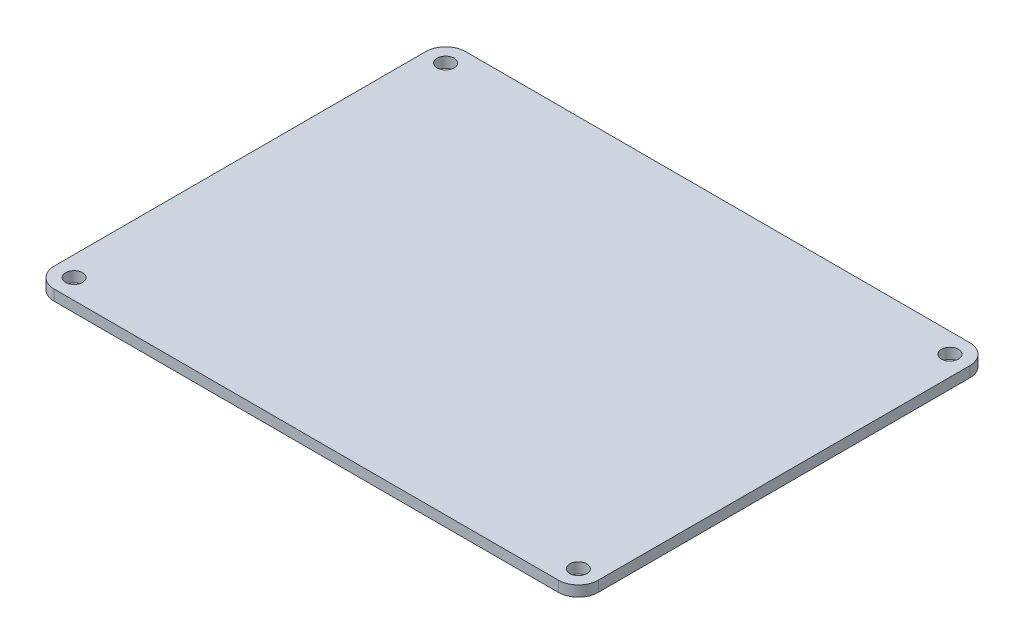
ISO-10303-21;
HEADER;
FILE_DESCRIPTION(('STEP AP214'),'2;1');
FILE_NAME('part.step','',(''),(''),'','','');
FILE_SCHEMA(('AUTOMOTIVE_DESIGN { 1 0 10303 214 1 1 1 1 }'));
ENDSEC;
DATA;
#1=APPLICATION_CONTEXT('core data for automotive mechanical design processes');
#2=APPLICATION_PROTOCOL_DEFINITION('international standard','automotive_design',2000,#1);
#3=PRODUCT_CONTEXT('',#1,'mechanical');
#4=PRODUCT('Part','Part','',(#3));
#5=PRODUCT_RELATED_PRODUCT_CATEGORY('part','',(#4));
#6=PRODUCT_DEFINITION_FORMATION('','',#4);
#7=PRODUCT_DEFINITION_CONTEXT('part definition',#1,'design');
#8=PRODUCT_DEFINITION('design','',#6,#7);
#9=PRODUCT_DEFINITION_SHAPE('','',#8);
#10=(LENGTH_UNIT() NAMED_UNIT(*) SI_UNIT(.MILLI.,.METRE.));
#11=(NAMED_UNIT(*) PLANE_ANGLE_UNIT() SI_UNIT($,.RADIAN.));
#12=(NAMED_UNIT(*) SI_UNIT($,.STERADIAN.) SOLID_ANGLE_UNIT());
#13=UNCERTAINTY_MEASURE_WITH_UNIT(LENGTH_MEASURE(1.E-05),#10,'distance_accuracy_value','');
#14=(GEOMETRIC_REPRESENTATION_CONTEXT(3) GLOBAL_UNCERTAINTY_ASSIGNED_CONTEXT((#13)) GLOBAL_UNIT_ASSIGNED_CONTEXT((#10,
#11,#12)) REPRESENTATION_CONTEXT('',''));
#15=CARTESIAN_POINT('',(0.,0.,0.));
#16=DIRECTION('',(0.,0.,1.));
#17=DIRECTION('',(1.,0.,0.));
#18=AXIS2_PLACEMENT_3D('',#15,#16,#17);
#19=CARTESIAN_POINT('',(-51.25,-2.,0.));
#20=DIRECTION('',(-1.,0.,0.));
#21=DIRECTION('',(0.,0.,1.));
#22=AXIS2_PLACEMENT_3D('',#19,#20,#21);
#23=PLANE('',#22);
#24=DIRECTION('',(0.,0.,1.));
#25=VECTOR('',#24,1.);
#26=CARTESIAN_POINT('',(-51.25,0.,0.));
#27=LINE('',#26,#25);
#28=CARTESIAN_POINT('',(-51.25,0.,-35.));
#29=VERTEX_POINT('',#28);
#30=CARTESIAN_POINT('',(-51.25,0.,35.));
#31=VERTEX_POINT('',#30);
#32=EDGE_CURVE('E148',#29,#31,#27,.T.);
#33=ORIENTED_EDGE('',*,*,#32,.F.);
#34=DIRECTION('',(0.,1.,0.));
#35=VECTOR('',#34,1.);
#36=CARTESIAN_POINT('',(-51.25,-2.,-35.));
#37=LINE('',#36,#35);
#38=CARTESIAN_POINT('',(-51.25,-2.,-35.));
#39=VERTEX_POINT('',#38);
#40=EDGE_CURVE('E11',#39,#29,#37,.T.);
#41=ORIENTED_EDGE('',*,*,#40,.F.);
#42=DIRECTION('',(0.,0.,1.));
#43=VECTOR('',#42,1.);
#44=CARTESIAN_POINT('',(-51.25,-2.,0.));
#45=LINE('',#44,#43);
#46=CARTESIAN_POINT('',(-51.25,-2.,35.));
#47=VERTEX_POINT('',#46);
#48=EDGE_CURVE('E180',#39,#47,#45,.T.);
#49=ORIENTED_EDGE('',*,*,#48,.T.);
#50=DIRECTION('',(0.,1.,0.));
#51=VECTOR('',#50,1.);
#52=CARTESIAN_POINT('',(-51.25,-2.,35.));
#53=LINE('',#52,#51);
#54=EDGE_CURVE('E42',#47,#31,#53,.T.);
#55=ORIENTED_EDGE('',*,*,#54,.T.);
#56=EDGE_LOOP('',(#33,#41,#49,#55));
#57=FACE_BOUND('',#56,.T.);
#58=ADVANCED_FACE('F39',(#57),#23,.T.);
#59=CARTESIAN_POINT('',(-47.5,-2.,-35.));
#60=DIRECTION('',(0.,1.,0.));
#61=DIRECTION('',(0.,0.,1.));
#62=AXIS2_PLACEMENT_3D('',#59,#60,#61);
#63=CYLINDRICAL_SURFACE('',#62,3.75000000000001);
#64=CARTESIAN_POINT('',(-47.5,0.,-35.));
#65=DIRECTION('',(0.,1.,0.));
#66=DIRECTION('',(0.,0.,1.));
#67=AXIS2_PLACEMENT_3D('',#64,#65,#66);
#68=CIRCLE('',#67,3.75000000000001);
#69=CARTESIAN_POINT('',(-47.5,0.,-38.75));
#70=VERTEX_POINT('',#69);
#71=EDGE_CURVE('E166',#70,#29,#68,.T.);
#72=ORIENTED_EDGE('',*,*,#71,.F.);
#73=DIRECTION('',(0.,1.,0.));
#74=VECTOR('',#73,1.);
#75=CARTESIAN_POINT('',(-47.5,-2.,-38.75));
#76=LINE('',#75,#74);
#77=CARTESIAN_POINT('',(-47.5,-2.,-38.75));
#78=VERTEX_POINT('',#77);
#79=EDGE_CURVE('E48',#78,#70,#76,.T.);
#80=ORIENTED_EDGE('',*,*,#79,.F.);
#81=CARTESIAN_POINT('',(-47.5,-2.,-35.));
#82=DIRECTION('',(0.,1.,0.));
#83=DIRECTION('',(0.,0.,1.));
#84=AXIS2_PLACEMENT_3D('',#81,#82,#83);
#85=CIRCLE('',#84,3.75000000000001);
#86=EDGE_CURVE('E117',#78,#39,#85,.T.);
#87=ORIENTED_EDGE('',*,*,#86,.T.);
#88=ORIENTED_EDGE('',*,*,#40,.T.);
#89=EDGE_LOOP('',(#72,#80,#87,#88));
#90=FACE_BOUND('',#89,.T.);
#91=ADVANCED_FACE('F193',(#90),#63,.T.);
#92=CARTESIAN_POINT('',(0.,-2.,-38.75));
#93=DIRECTION('',(0.,0.,1.));
#94=DIRECTION('',(1.,0.,0.));
#95=AXIS2_PLACEMENT_3D('',#92,#93,#94);
#96=PLANE('',#95);
#97=DIRECTION('',(1.,0.,0.));
#98=VECTOR('',#97,1.);
#99=CARTESIAN_POINT('',(0.,0.,-38.75));
#100=LINE('',#99,#98);
#101=CARTESIAN_POINT('',(47.5,0.,-38.75));
#102=VERTEX_POINT('',#101);
#103=EDGE_CURVE('E121',#70,#102,#100,.T.);
#104=ORIENTED_EDGE('',*,*,#103,.T.);
#105=DIRECTION('',(0.,1.,0.));
#106=VECTOR('',#105,1.);
#107=CARTESIAN_POINT('',(47.5,-2.,-38.75));
#108=LINE('',#107,#106);
#109=CARTESIAN_POINT('',(47.5,-2.,-38.75));
#110=VERTEX_POINT('',#109);
#111=EDGE_CURVE('E119',#110,#102,#108,.T.);
#112=ORIENTED_EDGE('',*,*,#111,.F.);
#113=DIRECTION('',(1.,0.,0.));
#114=VECTOR('',#113,1.);
#115=CARTESIAN_POINT('',(0.,-2.,-38.75));
#116=LINE('',#115,#114);
#117=EDGE_CURVE('E111',#78,#110,#116,.T.);
#118=ORIENTED_EDGE('',*,*,#117,.F.);
#119=ORIENTED_EDGE('',*,*,#79,.T.);
#120=EDGE_LOOP('',(#104,#112,#118,#119));
#121=FACE_BOUND('',#120,.T.);
#122=ADVANCED_FACE('F120',(#121),#96,.F.);
#123=CARTESIAN_POINT('',(47.5,-2.,-35.));
#124=DIRECTION('',(0.,1.,0.));
#125=DIRECTION('',(0.,0.,1.));
#126=AXIS2_PLACEMENT_3D('',#123,#124,#125);
#127=CYLINDRICAL_SURFACE('',#126,3.75);
#128=CARTESIAN_POINT('',(47.5,0.,-35.));
#129=DIRECTION('',(0.,1.,0.));
#130=DIRECTION('',(0.,0.,1.));
#131=AXIS2_PLACEMENT_3D('',#128,#129,#130);
#132=CIRCLE('',#131,3.75);
#133=CARTESIAN_POINT('',(51.25,0.,-35.));
#134=VERTEX_POINT('',#133);
#135=EDGE_CURVE('E163',#134,#102,#132,.T.);
#136=ORIENTED_EDGE('',*,*,#135,.F.);
#137=DIRECTION('',(0.,1.,0.));
#138=VECTOR('',#137,1.);
#139=CARTESIAN_POINT('',(51.25,-2.,-35.));
#140=LINE('',#139,#138);
#141=CARTESIAN_POINT('',(51.25,-2.,-35.));
#142=VERTEX_POINT('',#141);
#143=EDGE_CURVE('E125',#142,#134,#140,.T.);
#144=ORIENTED_EDGE('',*,*,#143,.F.);
#145=CARTESIAN_POINT('',(47.5,-2.,-35.));
#146=DIRECTION('',(0.,1.,0.));
#147=DIRECTION('',(0.,0.,1.));
#148=AXIS2_PLACEMENT_3D('',#145,#146,#147);
#149=CIRCLE('',#148,3.75);
#150=EDGE_CURVE('E116',#142,#110,#149,.T.);
#151=ORIENTED_EDGE('',*,*,#150,.T.);
#152=ORIENTED_EDGE('',*,*,#111,.T.);
#153=EDGE_LOOP('',(#136,#144,#151,#152));
#154=FACE_BOUND('',#153,.T.);
#155=ADVANCED_FACE('F127',(#154),#127,.T.);
#156=CARTESIAN_POINT('',(51.25,-2.,0.));
#157=DIRECTION('',(-1.,0.,0.));
#158=DIRECTION('',(0.,0.,1.));
#159=AXIS2_PLACEMENT_3D('',#156,#157,#158);
#160=PLANE('',#159);
#161=DIRECTION('',(0.,0.,1.));
#162=VECTOR('',#161,1.);
#163=CARTESIAN_POINT('',(51.25,0.,0.));
#164=LINE('',#163,#162);
#165=CARTESIAN_POINT('',(51.25,0.,35.));
#166=VERTEX_POINT('',#165);
#167=EDGE_CURVE('E160',#134,#166,#164,.T.);
#168=ORIENTED_EDGE('',*,*,#167,.T.);
#169=DIRECTION('',(0.,1.,0.));
#170=VECTOR('',#169,1.);
#171=CARTESIAN_POINT('',(51.25,-2.,35.));
#172=LINE('',#171,#170);
#173=CARTESIAN_POINT('',(51.25,-2.,35.));
#174=VERTEX_POINT('',#173);
#175=EDGE_CURVE('E184',#174,#166,#172,.T.);
#176=ORIENTED_EDGE('',*,*,#175,.F.);
#177=DIRECTION('',(0.,0.,1.));
#178=VECTOR('',#177,1.);
#179=CARTESIAN_POINT('',(51.25,-2.,0.));
#180=LINE('',#179,#178);
#181=EDGE_CURVE('E129',#142,#174,#180,.T.);
#182=ORIENTED_EDGE('',*,*,#181,.F.);
#183=ORIENTED_EDGE('',*,*,#143,.T.);
#184=EDGE_LOOP('',(#168,#176,#182,#183));
#185=FACE_BOUND('',#184,.T.);
#186=ADVANCED_FACE('F207',(#185),#160,.F.);
#187=CARTESIAN_POINT('',(47.5,-2.,35.));
#188=DIRECTION('',(0.,1.,0.));
#189=DIRECTION('',(0.,0.,1.));
#190=AXIS2_PLACEMENT_3D('',#187,#188,#189);
#191=CYLINDRICAL_SURFACE('',#190,3.75);
#192=CARTESIAN_POINT('',(47.5,0.,35.));
#193=DIRECTION('',(0.,1.,0.));
#194=DIRECTION('',(0.,0.,1.));
#195=AXIS2_PLACEMENT_3D('',#192,#193,#194);
#196=CIRCLE('',#195,3.75);
#197=CARTESIAN_POINT('',(47.5,0.,38.75));
#198=VERTEX_POINT('',#197);
#199=EDGE_CURVE('E157',#198,#166,#196,.T.);
#200=ORIENTED_EDGE('',*,*,#199,.F.);
#201=DIRECTION('',(0.,1.,0.));
#202=VECTOR('',#201,1.);
#203=CARTESIAN_POINT('',(47.5,-2.,38.75));
#204=LINE('',#203,#202);
#205=CARTESIAN_POINT('',(47.5,-2.,38.75));
#206=VERTEX_POINT('',#205);
#207=EDGE_CURVE('E186',#206,#198,#204,.T.);
#208=ORIENTED_EDGE('',*,*,#207,.F.);
#209=CARTESIAN_POINT('',(47.5,-2.,35.));
#210=DIRECTION('',(0.,1.,0.));
#211=DIRECTION('',(0.,0.,1.));
#212=AXIS2_PLACEMENT_3D('',#209,#210,#211);
#213=CIRCLE('',#212,3.75);
#214=EDGE_CURVE('E131',#206,#174,#213,.T.);
#215=ORIENTED_EDGE('',*,*,#214,.T.);
#216=ORIENTED_EDGE('',*,*,#175,.T.);
#217=EDGE_LOOP('',(#200,#208,#215,#216));
#218=FACE_BOUND('',#217,.T.);
#219=ADVANCED_FACE('F210',(#218),#191,.T.);
#220=CARTESIAN_POINT('',(0.,-2.,38.75));
#221=DIRECTION('',(0.,0.,1.));
#222=DIRECTION('',(1.,0.,0.));
#223=AXIS2_PLACEMENT_3D('',#220,#221,#222);
#224=PLANE('',#223);
#225=DIRECTION('',(1.,0.,0.));
#226=VECTOR('',#225,1.);
#227=CARTESIAN_POINT('',(0.,0.,38.75));
#228=LINE('',#227,#226);
#229=CARTESIAN_POINT('',(-47.5,0.,38.75));
#230=VERTEX_POINT('',#229);
#231=EDGE_CURVE('E154',#230,#198,#228,.T.);
#232=ORIENTED_EDGE('',*,*,#231,.F.);
#233=DIRECTION('',(0.,1.,0.));
#234=VECTOR('',#233,1.);
#235=CARTESIAN_POINT('',(-47.5,-2.,38.75));
#236=LINE('',#235,#234);
#237=CARTESIAN_POINT('',(-47.5,-2.,38.75));
#238=VERTEX_POINT('',#237);
#239=EDGE_CURVE('E187',#238,#230,#236,.T.);
#240=ORIENTED_EDGE('',*,*,#239,.F.);
#241=DIRECTION('',(1.,0.,0.));
#242=VECTOR('',#241,1.);
#243=CARTESIAN_POINT('',(0.,-2.,38.75));
#244=LINE('',#243,#242);
#245=EDGE_CURVE('E367',#238,#206,#244,.T.);
#246=ORIENTED_EDGE('',*,*,#245,.T.);
#247=ORIENTED_EDGE('',*,*,#207,.T.);
#248=EDGE_LOOP('',(#232,#240,#246,#247));
#249=FACE_BOUND('',#248,.T.);
#250=ADVANCED_FACE('F214',(#249),#224,.T.);
#251=CARTESIAN_POINT('',(47.5,-2.,35.));
#252=DIRECTION('',(0.,1.,0.));
#253=DIRECTION('',(0.,0.,1.));
#254=AXIS2_PLACEMENT_3D('',#251,#252,#253);
#255=CYLINDRICAL_SURFACE('',#254,1.6);
#256=CARTESIAN_POINT('',(47.5,-2.,35.));
#257=DIRECTION('',(0.,1.,0.));
#258=DIRECTION('',(0.,0.,1.));
#259=AXIS2_PLACEMENT_3D('',#256,#257,#258);
#260=CIRCLE('',#259,1.6);
#261=CARTESIAN_POINT('',(47.5,-2.,36.6));
#262=VERTEX_POINT('',#261);
#263=EDGE_CURVE('E142',#262,#262,#260,.T.);
#264=ORIENTED_EDGE('',*,*,#263,.F.);
#265=EDGE_LOOP('',(#264));
#266=FACE_BOUND('',#265,.T.);
#267=CARTESIAN_POINT('',(47.5,0.,35.));
#268=DIRECTION('',(0.,1.,0.));
#269=DIRECTION('',(0.,0.,1.));
#270=AXIS2_PLACEMENT_3D('',#267,#268,#269);
#271=CIRCLE('',#270,1.6);
#272=CARTESIAN_POINT('',(47.5,0.,36.6));
#273=VERTEX_POINT('',#272);
#274=EDGE_CURVE('E175',#273,#273,#271,.T.);
#275=ORIENTED_EDGE('',*,*,#274,.T.);
#276=EDGE_LOOP('',(#275));
#277=FACE_BOUND('',#276,.T.);
#278=ADVANCED_FACE('F217',(#266,#277),#255,.F.);
#279=CARTESIAN_POINT('',(47.5,-2.,-35.));
#280=DIRECTION('',(0.,1.,0.));
#281=DIRECTION('',(0.,0.,1.));
#282=AXIS2_PLACEMENT_3D('',#279,#280,#281);
#283=CYLINDRICAL_SURFACE('',#282,1.6);
#284=CARTESIAN_POINT('',(47.5,-2.,-35.));
#285=DIRECTION('',(0.,1.,0.));
#286=DIRECTION('',(0.,0.,1.));
#287=AXIS2_PLACEMENT_3D('',#284,#285,#286);
#288=CIRCLE('',#287,1.6);
#289=CARTESIAN_POINT('',(47.5,-2.,-33.4));
#290=VERTEX_POINT('',#289);
#291=EDGE_CURVE('E139',#290,#290,#288,.T.);
#292=ORIENTED_EDGE('',*,*,#291,.F.);
#293=EDGE_LOOP('',(#292));
#294=FACE_BOUND('',#293,.T.);
#295=CARTESIAN_POINT('',(47.5,0.,-35.));
#296=DIRECTION('',(0.,1.,0.));
#297=DIRECTION('',(0.,0.,1.));
#298=AXIS2_PLACEMENT_3D('',#295,#296,#297);
#299=CIRCLE('',#298,1.6);
#300=CARTESIAN_POINT('',(47.5,0.,-33.4));
#301=VERTEX_POINT('',#300);
#302=EDGE_CURVE('E172',#301,#301,#299,.T.);
#303=ORIENTED_EDGE('',*,*,#302,.T.);
#304=EDGE_LOOP('',(#303));
#305=FACE_BOUND('',#304,.T.);
#306=ADVANCED_FACE('F227',(#294,#305),#283,.F.);
#307=CARTESIAN_POINT('',(-47.5,-2.,-35.));
#308=DIRECTION('',(0.,1.,0.));
#309=DIRECTION('',(0.,0.,1.));
#310=AXIS2_PLACEMENT_3D('',#307,#308,#309);
#311=CYLINDRICAL_SURFACE('',#310,1.6);
#312=CARTESIAN_POINT('',(-47.5,-2.,-35.));
#313=DIRECTION('',(0.,1.,0.));
#314=DIRECTION('',(0.,0.,1.));
#315=AXIS2_PLACEMENT_3D('',#312,#313,#314);
#316=CIRCLE('',#315,1.6);
#317=CARTESIAN_POINT('',(-47.5,-2.,-33.4));
#318=VERTEX_POINT('',#317);
#319=EDGE_CURVE('E136',#318,#318,#316,.T.);
#320=ORIENTED_EDGE('',*,*,#319,.F.);
#321=EDGE_LOOP('',(#320));
#322=FACE_BOUND('',#321,.T.);
#323=CARTESIAN_POINT('',(-47.5,0.,-35.));
#324=DIRECTION('',(0.,1.,0.));
#325=DIRECTION('',(0.,0.,1.));
#326=AXIS2_PLACEMENT_3D('',#323,#324,#325);
#327=CIRCLE('',#326,1.6);
#328=CARTESIAN_POINT('',(-47.5,0.,-33.4));
#329=VERTEX_POINT('',#328);
#330=EDGE_CURVE('E169',#329,#329,#327,.T.);
#331=ORIENTED_EDGE('',*,*,#330,.T.);
#332=EDGE_LOOP('',(#331));
#333=FACE_BOUND('',#332,.T.);
#334=ADVANCED_FACE('F202',(#322,#333),#311,.F.);
#335=CARTESIAN_POINT('',(-47.5,-2.,35.));
#336=DIRECTION('',(0.,1.,0.));
#337=DIRECTION('',(0.,0.,1.));
#338=AXIS2_PLACEMENT_3D('',#335,#336,#337);
#339=CYLINDRICAL_SURFACE('',#338,3.75);
#340=CARTESIAN_POINT('',(-47.5,0.,35.));
#341=DIRECTION('',(0.,1.,0.));
#342=DIRECTION('',(0.,0.,1.));
#343=AXIS2_PLACEMENT_3D('',#340,#341,#342);
#344=CIRCLE('',#343,3.75);
#345=EDGE_CURVE('E151',#31,#230,#344,.T.);
#346=ORIENTED_EDGE('',*,*,#345,.F.);
#347=ORIENTED_EDGE('',*,*,#54,.F.);
#348=CARTESIAN_POINT('',(-47.5,-2.,35.));
#349=DIRECTION('',(0.,1.,0.));
#350=DIRECTION('',(0.,0.,1.));
#351=AXIS2_PLACEMENT_3D('',#348,#349,#350);
#352=CIRCLE('',#351,3.75);
#353=EDGE_CURVE('E368',#47,#238,#352,.T.);
#354=ORIENTED_EDGE('',*,*,#353,.T.);
#355=ORIENTED_EDGE('',*,*,#239,.T.);
#356=EDGE_LOOP('',(#346,#347,#354,#355));
#357=FACE_BOUND('',#356,.T.);
#358=ADVANCED_FACE('F189',(#357),#339,.T.);
#359=CARTESIAN_POINT('',(-47.5,-2.,35.));
#360=DIRECTION('',(0.,1.,0.));
#361=DIRECTION('',(0.,0.,1.));
#362=AXIS2_PLACEMENT_3D('',#359,#360,#361);
#363=CYLINDRICAL_SURFACE('',#362,1.6);
#364=CARTESIAN_POINT('',(-47.5,-2.,35.));
#365=DIRECTION('',(0.,1.,0.));
#366=DIRECTION('',(0.,0.,1.));
#367=AXIS2_PLACEMENT_3D('',#364,#365,#366);
#368=CIRCLE('',#367,1.6);
#369=CARTESIAN_POINT('',(-47.5,-2.,36.6));
#370=VERTEX_POINT('',#369);
#371=EDGE_CURVE('E145',#370,#370,#368,.T.);
#372=ORIENTED_EDGE('',*,*,#371,.F.);
#373=EDGE_LOOP('',(#372));
#374=FACE_BOUND('',#373,.T.);
#375=CARTESIAN_POINT('',(-47.5,0.,35.));
#376=DIRECTION('',(0.,1.,0.));
#377=DIRECTION('',(0.,0.,1.));
#378=AXIS2_PLACEMENT_3D('',#375,#376,#377);
#379=CIRCLE('',#378,1.6);
#380=CARTESIAN_POINT('',(-47.5,0.,36.6));
#381=VERTEX_POINT('',#380);
#382=EDGE_CURVE('E178',#381,#381,#379,.T.);
#383=ORIENTED_EDGE('',*,*,#382,.T.);
#384=EDGE_LOOP('',(#383));
#385=FACE_BOUND('',#384,.T.);
#386=ADVANCED_FACE('F220',(#374,#385),#363,.F.);
#387=CARTESIAN_POINT('',(0.,-2.,0.));
#388=DIRECTION('',(0.,1.,0.));
#389=DIRECTION('',(0.,0.,1.));
#390=AXIS2_PLACEMENT_3D('',#387,#388,#389);
#391=PLANE('',#390);
#392=ORIENTED_EDGE('',*,*,#48,.F.);
#393=ORIENTED_EDGE('',*,*,#86,.F.);
#394=ORIENTED_EDGE('',*,*,#117,.T.);
#395=ORIENTED_EDGE('',*,*,#150,.F.);
#396=ORIENTED_EDGE('',*,*,#181,.T.);
#397=ORIENTED_EDGE('',*,*,#214,.F.);
#398=ORIENTED_EDGE('',*,*,#245,.F.);
#399=ORIENTED_EDGE('',*,*,#353,.F.);
#400=EDGE_LOOP('',(#392,#393,#394,#395,#396,#397,#398,#399));
#401=FACE_BOUND('',#400,.T.);
#402=ORIENTED_EDGE('',*,*,#319,.T.);
#403=EDGE_LOOP('',(#402));
#404=FACE_BOUND('',#403,.T.);
#405=ORIENTED_EDGE('',*,*,#291,.T.);
#406=EDGE_LOOP('',(#405));
#407=FACE_BOUND('',#406,.T.);
#408=ORIENTED_EDGE('',*,*,#263,.T.);
#409=EDGE_LOOP('',(#408));
#410=FACE_BOUND('',#409,.T.);
#411=ORIENTED_EDGE('',*,*,#371,.T.);
#412=EDGE_LOOP('',(#411));
#413=FACE_BOUND('',#412,.T.);
#414=ADVANCED_FACE('F113',(#401,#404,#407,#410,#413),#391,.F.);
#415=CARTESIAN_POINT('',(0.,0.,0.));
#416=DIRECTION('',(0.,1.,0.));
#417=DIRECTION('',(0.,0.,1.));
#418=AXIS2_PLACEMENT_3D('',#415,#416,#417);
#419=PLANE('',#418);
#420=ORIENTED_EDGE('',*,*,#32,.T.);
#421=ORIENTED_EDGE('',*,*,#345,.T.);
#422=ORIENTED_EDGE('',*,*,#231,.T.);
#423=ORIENTED_EDGE('',*,*,#199,.T.);
#424=ORIENTED_EDGE('',*,*,#167,.F.);
#425=ORIENTED_EDGE('',*,*,#135,.T.);
#426=ORIENTED_EDGE('',*,*,#103,.F.);
#427=ORIENTED_EDGE('',*,*,#71,.T.);
#428=EDGE_LOOP('',(#420,#421,#422,#423,#424,#425,#426,#427));
#429=FACE_BOUND('',#428,.T.);
#430=ORIENTED_EDGE('',*,*,#330,.F.);
#431=EDGE_LOOP('',(#430));
#432=FACE_BOUND('',#431,.T.);
#433=ORIENTED_EDGE('',*,*,#302,.F.);
#434=EDGE_LOOP('',(#433));
#435=FACE_BOUND('',#434,.T.);
#436=ORIENTED_EDGE('',*,*,#274,.F.);
#437=EDGE_LOOP('',(#436));
#438=FACE_BOUND('',#437,.T.);
#439=ORIENTED_EDGE('',*,*,#382,.F.);
#440=EDGE_LOOP('',(#439));
#441=FACE_BOUND('',#440,.T.);
#442=ADVANCED_FACE('F191',(#429,#432,#435,#438,#441),#419,.T.);
#443=CLOSED_SHELL('',(#58,#91,#122,#155,#186,#219,#250,#278,#306,#334,#358,#386,#414,#442));
#444=MANIFOLD_SOLID_BREP('B2',#443);
#445=ADVANCED_BREP_SHAPE_REPRESENTATION('',(#18,#444),#14);
#446=SHAPE_DEFINITION_REPRESENTATION(#9,#445);
ENDSEC;
END-ISO-10303-21;
